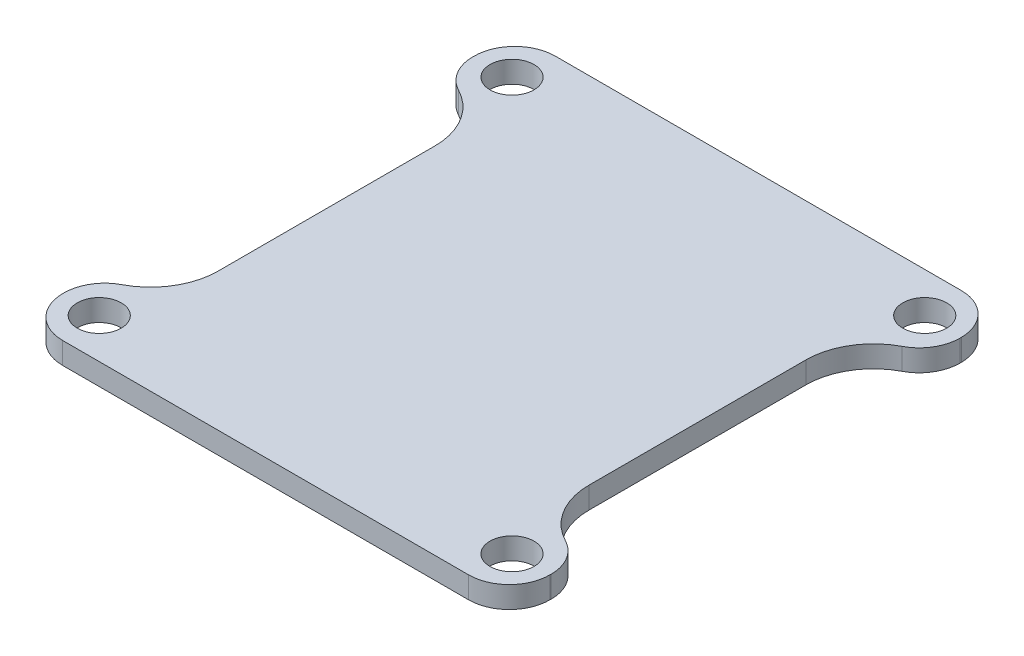
ISO-10303-21;
HEADER;
FILE_DESCRIPTION(('STEP AP214'),'2;1');
FILE_NAME('part.step','',(''),(''),'','','');
FILE_SCHEMA(('AUTOMOTIVE_DESIGN { 1 0 10303 214 1 1 1 1 }'));
ENDSEC;
DATA;
#1=APPLICATION_CONTEXT('core data for automotive mechanical design processes');
#2=APPLICATION_PROTOCOL_DEFINITION('international standard','automotive_design',2000,#1);
#3=PRODUCT_CONTEXT('',#1,'mechanical');
#4=PRODUCT('Part','Part','',(#3));
#5=PRODUCT_RELATED_PRODUCT_CATEGORY('part','',(#4));
#6=PRODUCT_DEFINITION_FORMATION('','',#4);
#7=PRODUCT_DEFINITION_CONTEXT('part definition',#1,'design');
#8=PRODUCT_DEFINITION('design','',#6,#7);
#9=PRODUCT_DEFINITION_SHAPE('','',#8);
#10=(LENGTH_UNIT() NAMED_UNIT(*) SI_UNIT(.MILLI.,.METRE.));
#11=(NAMED_UNIT(*) PLANE_ANGLE_UNIT() SI_UNIT($,.RADIAN.));
#12=(NAMED_UNIT(*) SI_UNIT($,.STERADIAN.) SOLID_ANGLE_UNIT());
#13=UNCERTAINTY_MEASURE_WITH_UNIT(LENGTH_MEASURE(1.E-05),#10,'distance_accuracy_value','');
#14=(GEOMETRIC_REPRESENTATION_CONTEXT(3) GLOBAL_UNCERTAINTY_ASSIGNED_CONTEXT((#13)) GLOBAL_UNIT_ASSIGNED_CONTEXT((#10,
#11,#12)) REPRESENTATION_CONTEXT('',''));
#15=CARTESIAN_POINT('',(0.,0.,0.));
#16=DIRECTION('',(0.,0.,1.));
#17=DIRECTION('',(1.,0.,0.));
#18=AXIS2_PLACEMENT_3D('',#15,#16,#17);
#19=CARTESIAN_POINT('',(0.,1.6,18.2));
#20=DIRECTION('',(0.,0.,-1.));
#21=DIRECTION('',(-1.,0.,0.));
#22=AXIS2_PLACEMENT_3D('',#19,#20,#21);
#23=PLANE('',#22);
#24=DIRECTION('',(1.,0.,0.));
#25=VECTOR('',#24,1.);
#26=CARTESIAN_POINT('',(0.,0.,18.2));
#27=LINE('',#26,#25);
#28=CARTESIAN_POINT('',(-15.,0.,18.2));
#29=VERTEX_POINT('',#28);
#30=CARTESIAN_POINT('',(15.,0.,18.2));
#31=VERTEX_POINT('',#30);
#32=EDGE_CURVE('E340',#29,#31,#27,.T.);
#33=ORIENTED_EDGE('',*,*,#32,.T.);
#34=DIRECTION('',(0.,-1.,0.));
#35=VECTOR('',#34,1.);
#36=CARTESIAN_POINT('',(15.,1.6,18.2));
#37=LINE('',#36,#35);
#38=CARTESIAN_POINT('',(15.,1.6,18.2));
#39=VERTEX_POINT('',#38);
#40=EDGE_CURVE('E267',#31,#39,#37,.F.);
#41=ORIENTED_EDGE('',*,*,#40,.T.);
#42=DIRECTION('',(1.,0.,0.));
#43=VECTOR('',#42,1.);
#44=CARTESIAN_POINT('',(0.,1.6,18.2));
#45=LINE('',#44,#43);
#46=CARTESIAN_POINT('',(-15.,1.6,18.2));
#47=VERTEX_POINT('',#46);
#48=EDGE_CURVE('E369',#47,#39,#45,.T.);
#49=ORIENTED_EDGE('',*,*,#48,.F.);
#50=DIRECTION('',(0.,-1.,0.));
#51=VECTOR('',#50,1.);
#52=CARTESIAN_POINT('',(-15.,1.6,18.2));
#53=LINE('',#52,#51);
#54=EDGE_CURVE('E264',#47,#29,#53,.T.);
#55=ORIENTED_EDGE('',*,*,#54,.T.);
#56=EDGE_LOOP('',(#33,#41,#49,#55));
#57=FACE_BOUND('',#56,.T.);
#58=ADVANCED_FACE('F39',(#57),#23,.F.);
#59=CARTESIAN_POINT('',(18.,1.6,0.));
#60=DIRECTION('',(1.,0.,0.));
#61=DIRECTION('',(0.,0.,-1.));
#62=AXIS2_PLACEMENT_3D('',#59,#60,#61);
#63=PLANE('',#62);
#64=DIRECTION('',(0.,0.,1.));
#65=VECTOR('',#64,1.);
#66=CARTESIAN_POINT('',(18.,0.,0.));
#67=LINE('',#66,#65);
#68=CARTESIAN_POINT('',(18.,0.,15.1));
#69=VERTEX_POINT('',#68);
#70=CARTESIAN_POINT('',(18.,0.,15.2));
#71=VERTEX_POINT('',#70);
#72=EDGE_CURVE('E337',#69,#71,#67,.T.);
#73=ORIENTED_EDGE('',*,*,#72,.F.);
#74=DIRECTION('',(0.,-1.,0.));
#75=VECTOR('',#74,1.);
#76=CARTESIAN_POINT('',(18.,1.6,15.1));
#77=LINE('',#76,#75);
#78=CARTESIAN_POINT('',(18.,1.6,15.1));
#79=VERTEX_POINT('',#78);
#80=EDGE_CURVE('E262',#69,#79,#77,.F.);
#81=ORIENTED_EDGE('',*,*,#80,.T.);
#82=DIRECTION('',(0.,0.,1.));
#83=VECTOR('',#82,1.);
#84=CARTESIAN_POINT('',(18.,1.6,0.));
#85=LINE('',#84,#83);
#86=CARTESIAN_POINT('',(18.,1.6,15.2));
#87=VERTEX_POINT('',#86);
#88=EDGE_CURVE('E366',#79,#87,#85,.T.);
#89=ORIENTED_EDGE('',*,*,#88,.T.);
#90=DIRECTION('',(0.,-1.,0.));
#91=VECTOR('',#90,1.);
#92=CARTESIAN_POINT('',(18.,0.,15.2));
#93=LINE('',#92,#91);
#94=EDGE_CURVE('E259',#87,#71,#93,.T.);
#95=ORIENTED_EDGE('',*,*,#94,.T.);
#96=EDGE_LOOP('',(#73,#81,#89,#95));
#97=FACE_BOUND('',#96,.T.);
#98=ADVANCED_FACE('F393',(#97),#63,.T.);
#99=CARTESIAN_POINT('',(13.7,1.6,0.));
#100=DIRECTION('',(1.,0.,0.));
#101=DIRECTION('',(0.,0.,-1.));
#102=AXIS2_PLACEMENT_3D('',#99,#100,#101);
#103=PLANE('',#102);
#104=DIRECTION('',(0.,0.,1.));
#105=VECTOR('',#104,1.);
#106=CARTESIAN_POINT('',(13.7,0.,0.));
#107=LINE('',#106,#105);
#108=CARTESIAN_POINT('',(13.7,0.,-8.00704574947786));
#109=VERTEX_POINT('',#108);
#110=CARTESIAN_POINT('',(13.7,0.,8.00704574947787));
#111=VERTEX_POINT('',#110);
#112=EDGE_CURVE('E334',#109,#111,#107,.T.);
#113=ORIENTED_EDGE('',*,*,#112,.F.);
#114=DIRECTION('',(0.,1.,0.));
#115=VECTOR('',#114,1.);
#116=CARTESIAN_POINT('',(13.7,1.6,-8.00704574947786));
#117=LINE('',#116,#115);
#118=CARTESIAN_POINT('',(13.7,1.6,-8.00704574947786));
#119=VERTEX_POINT('',#118);
#120=EDGE_CURVE('E280',#109,#119,#117,.T.);
#121=ORIENTED_EDGE('',*,*,#120,.T.);
#122=DIRECTION('',(0.,0.,1.));
#123=VECTOR('',#122,1.);
#124=CARTESIAN_POINT('',(13.7,1.6,0.));
#125=LINE('',#124,#123);
#126=CARTESIAN_POINT('',(13.7,1.6,8.00704574947787));
#127=VERTEX_POINT('',#126);
#128=EDGE_CURVE('E363',#119,#127,#125,.T.);
#129=ORIENTED_EDGE('',*,*,#128,.T.);
#130=DIRECTION('',(0.,-1.,0.));
#131=VECTOR('',#130,1.);
#132=CARTESIAN_POINT('',(13.7,0.,8.00704574947787));
#133=LINE('',#132,#131);
#134=EDGE_CURVE('E277',#127,#111,#133,.T.);
#135=ORIENTED_EDGE('',*,*,#134,.T.);
#136=EDGE_LOOP('',(#113,#121,#129,#135));
#137=FACE_BOUND('',#136,.T.);
#138=ADVANCED_FACE('F399',(#137),#103,.T.);
#139=CARTESIAN_POINT('',(18.,1.6,0.));
#140=DIRECTION('',(1.,0.,0.));
#141=DIRECTION('',(0.,0.,-1.));
#142=AXIS2_PLACEMENT_3D('',#139,#140,#141);
#143=PLANE('',#142);
#144=DIRECTION('',(0.,0.,1.));
#145=VECTOR('',#144,1.);
#146=CARTESIAN_POINT('',(18.,1.6,0.));
#147=LINE('',#146,#145);
#148=CARTESIAN_POINT('',(18.,1.6,-15.2));
#149=VERTEX_POINT('',#148);
#150=CARTESIAN_POINT('',(18.,1.6,-15.1));
#151=VERTEX_POINT('',#150);
#152=EDGE_CURVE('E360',#149,#151,#147,.T.);
#153=ORIENTED_EDGE('',*,*,#152,.T.);
#154=DIRECTION('',(0.,-1.,0.));
#155=VECTOR('',#154,1.);
#156=CARTESIAN_POINT('',(18.,1.6,-15.1));
#157=LINE('',#156,#155);
#158=CARTESIAN_POINT('',(18.,0.,-15.1));
#159=VERTEX_POINT('',#158);
#160=EDGE_CURVE('E256',#151,#159,#157,.T.);
#161=ORIENTED_EDGE('',*,*,#160,.T.);
#162=DIRECTION('',(0.,0.,1.));
#163=VECTOR('',#162,1.);
#164=CARTESIAN_POINT('',(18.,0.,0.));
#165=LINE('',#164,#163);
#166=CARTESIAN_POINT('',(18.,0.,-15.2));
#167=VERTEX_POINT('',#166);
#168=EDGE_CURVE('E329',#167,#159,#165,.T.);
#169=ORIENTED_EDGE('',*,*,#168,.F.);
#170=DIRECTION('',(0.,-1.,0.));
#171=VECTOR('',#170,1.);
#172=CARTESIAN_POINT('',(18.,1.6,-15.2));
#173=LINE('',#172,#171);
#174=EDGE_CURVE('E254',#167,#149,#173,.F.);
#175=ORIENTED_EDGE('',*,*,#174,.T.);
#176=EDGE_LOOP('',(#153,#161,#169,#175));
#177=FACE_BOUND('',#176,.T.);
#178=ADVANCED_FACE('F523',(#177),#143,.T.);
#179=CARTESIAN_POINT('',(0.,1.6,-18.2));
#180=DIRECTION('',(0.,0.,-1.));
#181=DIRECTION('',(-1.,0.,0.));
#182=AXIS2_PLACEMENT_3D('',#179,#180,#181);
#183=PLANE('',#182);
#184=DIRECTION('',(1.,0.,0.));
#185=VECTOR('',#184,1.);
#186=CARTESIAN_POINT('',(0.,0.,-18.2));
#187=LINE('',#186,#185);
#188=CARTESIAN_POINT('',(-15.,0.,-18.2));
#189=VERTEX_POINT('',#188);
#190=CARTESIAN_POINT('',(15.,0.,-18.2));
#191=VERTEX_POINT('',#190);
#192=EDGE_CURVE('E327',#189,#191,#187,.T.);
#193=ORIENTED_EDGE('',*,*,#192,.F.);
#194=DIRECTION('',(0.,-1.,0.));
#195=VECTOR('',#194,1.);
#196=CARTESIAN_POINT('',(-15.,1.6,-18.2));
#197=LINE('',#196,#195);
#198=CARTESIAN_POINT('',(-15.,1.6,-18.2));
#199=VERTEX_POINT('',#198);
#200=EDGE_CURVE('E272',#189,#199,#197,.F.);
#201=ORIENTED_EDGE('',*,*,#200,.T.);
#202=DIRECTION('',(1.,0.,0.));
#203=VECTOR('',#202,1.);
#204=CARTESIAN_POINT('',(0.,1.6,-18.2));
#205=LINE('',#204,#203);
#206=CARTESIAN_POINT('',(15.,1.6,-18.2));
#207=VERTEX_POINT('',#206);
#208=EDGE_CURVE('E357',#199,#207,#205,.T.);
#209=ORIENTED_EDGE('',*,*,#208,.T.);
#210=DIRECTION('',(0.,-1.,0.));
#211=VECTOR('',#210,1.);
#212=CARTESIAN_POINT('',(15.,1.6,-18.2));
#213=LINE('',#212,#211);
#214=EDGE_CURVE('E269',#207,#191,#213,.T.);
#215=ORIENTED_EDGE('',*,*,#214,.T.);
#216=EDGE_LOOP('',(#193,#201,#209,#215));
#217=FACE_BOUND('',#216,.T.);
#218=ADVANCED_FACE('F567',(#217),#183,.T.);
#219=CARTESIAN_POINT('',(-18.,1.6,0.));
#220=DIRECTION('',(1.,0.,0.));
#221=DIRECTION('',(0.,0.,-1.));
#222=AXIS2_PLACEMENT_3D('',#219,#220,#221);
#223=PLANE('',#222);
#224=DIRECTION('',(0.,0.,1.));
#225=VECTOR('',#224,1.);
#226=CARTESIAN_POINT('',(-18.,0.,0.));
#227=LINE('',#226,#225);
#228=CARTESIAN_POINT('',(-18.,0.,-15.2));
#229=VERTEX_POINT('',#228);
#230=CARTESIAN_POINT('',(-18.,0.,-15.1));
#231=VERTEX_POINT('',#230);
#232=EDGE_CURVE('E209',#229,#231,#227,.T.);
#233=ORIENTED_EDGE('',*,*,#232,.T.);
#234=DIRECTION('',(0.,-1.,0.));
#235=VECTOR('',#234,1.);
#236=CARTESIAN_POINT('',(-18.,1.6,-15.1));
#237=LINE('',#236,#235);
#238=CARTESIAN_POINT('',(-18.,1.6,-15.1));
#239=VERTEX_POINT('',#238);
#240=EDGE_CURVE('E252',#231,#239,#237,.F.);
#241=ORIENTED_EDGE('',*,*,#240,.T.);
#242=DIRECTION('',(0.,0.,1.));
#243=VECTOR('',#242,1.);
#244=CARTESIAN_POINT('',(-18.,1.6,0.));
#245=LINE('',#244,#243);
#246=CARTESIAN_POINT('',(-18.,1.6,-15.2));
#247=VERTEX_POINT('',#246);
#248=EDGE_CURVE('E319',#247,#239,#245,.T.);
#249=ORIENTED_EDGE('',*,*,#248,.F.);
#250=DIRECTION('',(0.,-1.,0.));
#251=VECTOR('',#250,1.);
#252=CARTESIAN_POINT('',(-18.,0.,-15.2));
#253=LINE('',#252,#251);
#254=EDGE_CURVE('E249',#247,#229,#253,.T.);
#255=ORIENTED_EDGE('',*,*,#254,.T.);
#256=EDGE_LOOP('',(#233,#241,#249,#255));
#257=FACE_BOUND('',#256,.T.);
#258=ADVANCED_FACE('F324',(#257),#223,.F.);
#259=CARTESIAN_POINT('',(-13.7,1.6,0.));
#260=DIRECTION('',(1.,0.,0.));
#261=DIRECTION('',(0.,0.,-1.));
#262=AXIS2_PLACEMENT_3D('',#259,#260,#261);
#263=PLANE('',#262);
#264=DIRECTION('',(0.,0.,1.));
#265=VECTOR('',#264,1.);
#266=CARTESIAN_POINT('',(-13.7,0.,0.));
#267=LINE('',#266,#265);
#268=CARTESIAN_POINT('',(-13.7,0.,-8.00704574947786));
#269=VERTEX_POINT('',#268);
#270=CARTESIAN_POINT('',(-13.7,0.,8.00704574947787));
#271=VERTEX_POINT('',#270);
#272=EDGE_CURVE('E203',#269,#271,#267,.T.);
#273=ORIENTED_EDGE('',*,*,#272,.T.);
#274=DIRECTION('',(0.,-1.,0.));
#275=VECTOR('',#274,1.);
#276=CARTESIAN_POINT('',(-13.7,1.6,8.00704574947787));
#277=LINE('',#276,#275);
#278=CARTESIAN_POINT('',(-13.7,1.6,8.00704574947787));
#279=VERTEX_POINT('',#278);
#280=EDGE_CURVE('E288',#271,#279,#277,.F.);
#281=ORIENTED_EDGE('',*,*,#280,.T.);
#282=DIRECTION('',(0.,0.,1.));
#283=VECTOR('',#282,1.);
#284=CARTESIAN_POINT('',(-13.7,1.6,0.));
#285=LINE('',#284,#283);
#286=CARTESIAN_POINT('',(-13.7,1.6,-8.00704574947786));
#287=VERTEX_POINT('',#286);
#288=EDGE_CURVE('E308',#287,#279,#285,.T.);
#289=ORIENTED_EDGE('',*,*,#288,.F.);
#290=DIRECTION('',(0.,1.,0.));
#291=VECTOR('',#290,1.);
#292=CARTESIAN_POINT('',(-13.7,1.6,-8.00704574947786));
#293=LINE('',#292,#291);
#294=EDGE_CURVE('E285',#287,#269,#293,.F.);
#295=ORIENTED_EDGE('',*,*,#294,.T.);
#296=EDGE_LOOP('',(#273,#281,#289,#295));
#297=FACE_BOUND('',#296,.T.);
#298=ADVANCED_FACE('F313',(#297),#263,.F.);
#299=CARTESIAN_POINT('',(-15.25,1.6,-15.25));
#300=DIRECTION('',(0.,-1.,0.));
#301=DIRECTION('',(0.,0.,-1.));
#302=AXIS2_PLACEMENT_3D('',#299,#300,#301);
#303=CYLINDRICAL_SURFACE('',#302,1.625);
#304=CARTESIAN_POINT('',(-15.25,1.6,-15.25));
#305=DIRECTION('',(0.,1.,0.));
#306=DIRECTION('',(0.,0.,1.));
#307=AXIS2_PLACEMENT_3D('',#304,#305,#306);
#308=CIRCLE('',#307,1.625);
#309=CARTESIAN_POINT('',(-15.25,1.6,-13.625));
#310=VERTEX_POINT('',#309);
#311=EDGE_CURVE('E348',#310,#310,#308,.T.);
#312=ORIENTED_EDGE('',*,*,#311,.T.);
#313=EDGE_LOOP('',(#312));
#314=FACE_BOUND('',#313,.T.);
#315=CARTESIAN_POINT('',(-15.25,0.,-15.25));
#316=DIRECTION('',(0.,1.,0.));
#317=DIRECTION('',(0.,0.,1.));
#318=AXIS2_PLACEMENT_3D('',#315,#316,#317);
#319=CIRCLE('',#318,1.625);
#320=CARTESIAN_POINT('',(-15.25,0.,-13.625));
#321=VERTEX_POINT('',#320);
#322=EDGE_CURVE('E206',#321,#321,#319,.T.);
#323=ORIENTED_EDGE('',*,*,#322,.F.);
#324=EDGE_LOOP('',(#323));
#325=FACE_BOUND('',#324,.T.);
#326=ADVANCED_FACE('F510',(#314,#325),#303,.F.);
#327=CARTESIAN_POINT('',(15.25,1.6,15.25));
#328=DIRECTION('',(0.,-1.,0.));
#329=DIRECTION('',(0.,0.,-1.));
#330=AXIS2_PLACEMENT_3D('',#327,#328,#329);
#331=CYLINDRICAL_SURFACE('',#330,1.625);
#332=CARTESIAN_POINT('',(15.25,1.6,15.25));
#333=DIRECTION('',(0.,1.,0.));
#334=DIRECTION('',(0.,0.,1.));
#335=AXIS2_PLACEMENT_3D('',#332,#333,#334);
#336=CIRCLE('',#335,1.625);
#337=CARTESIAN_POINT('',(15.25,1.6,16.875));
#338=VERTEX_POINT('',#337);
#339=EDGE_CURVE('E351',#338,#338,#336,.T.);
#340=ORIENTED_EDGE('',*,*,#339,.T.);
#341=EDGE_LOOP('',(#340));
#342=FACE_BOUND('',#341,.T.);
#343=CARTESIAN_POINT('',(15.25,0.,15.25));
#344=DIRECTION('',(0.,1.,0.));
#345=DIRECTION('',(0.,0.,1.));
#346=AXIS2_PLACEMENT_3D('',#343,#344,#345);
#347=CIRCLE('',#346,1.625);
#348=CARTESIAN_POINT('',(15.25,0.,16.875));
#349=VERTEX_POINT('',#348);
#350=EDGE_CURVE('E202',#349,#349,#347,.T.);
#351=ORIENTED_EDGE('',*,*,#350,.F.);
#352=EDGE_LOOP('',(#351));
#353=FACE_BOUND('',#352,.T.);
#354=ADVANCED_FACE('F557',(#342,#353),#331,.F.);
#355=CARTESIAN_POINT('',(-18.,1.6,0.));
#356=DIRECTION('',(1.,0.,0.));
#357=DIRECTION('',(0.,0.,-1.));
#358=AXIS2_PLACEMENT_3D('',#355,#356,#357);
#359=PLANE('',#358);
#360=DIRECTION('',(0.,0.,1.));
#361=VECTOR('',#360,1.);
#362=CARTESIAN_POINT('',(-18.,1.6,0.));
#363=LINE('',#362,#361);
#364=CARTESIAN_POINT('',(-18.,1.6,15.1));
#365=VERTEX_POINT('',#364);
#366=CARTESIAN_POINT('',(-18.,1.6,15.2));
#367=VERTEX_POINT('',#366);
#368=EDGE_CURVE('E194',#365,#367,#363,.T.);
#369=ORIENTED_EDGE('',*,*,#368,.F.);
#370=DIRECTION('',(0.,-1.,0.));
#371=VECTOR('',#370,1.);
#372=CARTESIAN_POINT('',(-18.,1.6,15.1));
#373=LINE('',#372,#371);
#374=CARTESIAN_POINT('',(-18.,0.,15.1));
#375=VERTEX_POINT('',#374);
#376=EDGE_CURVE('E180',#365,#375,#373,.T.);
#377=ORIENTED_EDGE('',*,*,#376,.T.);
#378=DIRECTION('',(0.,0.,1.));
#379=VECTOR('',#378,1.);
#380=CARTESIAN_POINT('',(-18.,0.,0.));
#381=LINE('',#380,#379);
#382=CARTESIAN_POINT('',(-18.,0.,15.2));
#383=VERTEX_POINT('',#382);
#384=EDGE_CURVE('E191',#375,#383,#381,.T.);
#385=ORIENTED_EDGE('',*,*,#384,.T.);
#386=DIRECTION('',(0.,-1.,0.));
#387=VECTOR('',#386,1.);
#388=CARTESIAN_POINT('',(-18.,1.6,15.2));
#389=LINE('',#388,#387);
#390=EDGE_CURVE('E196',#383,#367,#389,.F.);
#391=ORIENTED_EDGE('',*,*,#390,.T.);
#392=EDGE_LOOP('',(#369,#377,#385,#391));
#393=FACE_BOUND('',#392,.T.);
#394=ADVANCED_FACE('F190',(#393),#359,.F.);
#395=CARTESIAN_POINT('',(-15.25,1.6,15.25));
#396=DIRECTION('',(0.,-1.,0.));
#397=DIRECTION('',(0.,0.,-1.));
#398=AXIS2_PLACEMENT_3D('',#395,#396,#397);
#399=CYLINDRICAL_SURFACE('',#398,1.625);
#400=CARTESIAN_POINT('',(-15.25,1.6,15.25));
#401=DIRECTION('',(0.,1.,0.));
#402=DIRECTION('',(0.,0.,1.));
#403=AXIS2_PLACEMENT_3D('',#400,#401,#402);
#404=CIRCLE('',#403,1.625);
#405=CARTESIAN_POINT('',(-15.25,1.6,16.875));
#406=VERTEX_POINT('',#405);
#407=EDGE_CURVE('E218',#406,#406,#404,.F.);
#408=ORIENTED_EDGE('',*,*,#407,.F.);
#409=EDGE_LOOP('',(#408));
#410=FACE_BOUND('',#409,.T.);
#411=CARTESIAN_POINT('',(-15.25,0.,15.25));
#412=DIRECTION('',(0.,1.,0.));
#413=DIRECTION('',(0.,0.,1.));
#414=AXIS2_PLACEMENT_3D('',#411,#412,#413);
#415=CIRCLE('',#414,1.625);
#416=CARTESIAN_POINT('',(-15.25,0.,16.875));
#417=VERTEX_POINT('',#416);
#418=EDGE_CURVE('E343',#417,#417,#415,.F.);
#419=ORIENTED_EDGE('',*,*,#418,.T.);
#420=EDGE_LOOP('',(#419));
#421=FACE_BOUND('',#420,.T.);
#422=ADVANCED_FACE('F376',(#410,#421),#399,.F.);
#423=CARTESIAN_POINT('',(15.25,1.6,-15.25));
#424=DIRECTION('',(0.,-1.,0.));
#425=DIRECTION('',(0.,0.,-1.));
#426=AXIS2_PLACEMENT_3D('',#423,#424,#425);
#427=CYLINDRICAL_SURFACE('',#426,1.625);
#428=CARTESIAN_POINT('',(15.25,1.6,-15.25));
#429=DIRECTION('',(0.,1.,0.));
#430=DIRECTION('',(0.,0.,1.));
#431=AXIS2_PLACEMENT_3D('',#428,#429,#430);
#432=CIRCLE('',#431,1.625);
#433=CARTESIAN_POINT('',(15.25,1.6,-13.625));
#434=VERTEX_POINT('',#433);
#435=EDGE_CURVE('E219',#434,#434,#432,.F.);
#436=ORIENTED_EDGE('',*,*,#435,.F.);
#437=EDGE_LOOP('',(#436));
#438=FACE_BOUND('',#437,.T.);
#439=CARTESIAN_POINT('',(15.25,0.,-15.25));
#440=DIRECTION('',(0.,1.,0.));
#441=DIRECTION('',(0.,0.,1.));
#442=AXIS2_PLACEMENT_3D('',#439,#440,#441);
#443=CIRCLE('',#442,1.625);
#444=CARTESIAN_POINT('',(15.25,0.,-13.625));
#445=VERTEX_POINT('',#444);
#446=EDGE_CURVE('E215',#445,#445,#443,.F.);
#447=ORIENTED_EDGE('',*,*,#446,.T.);
#448=EDGE_LOOP('',(#447));
#449=FACE_BOUND('',#448,.T.);
#450=ADVANCED_FACE('F379',(#438,#449),#427,.F.);
#451=CARTESIAN_POINT('',(0.,1.6,0.));
#452=DIRECTION('',(0.,1.,0.));
#453=DIRECTION('',(0.,0.,1.));
#454=AXIS2_PLACEMENT_3D('',#451,#452,#453);
#455=PLANE('',#454);
#456=ORIENTED_EDGE('',*,*,#407,.T.);
#457=EDGE_LOOP('',(#456));
#458=FACE_BOUND('',#457,.T.);
#459=ORIENTED_EDGE('',*,*,#288,.T.);
#460=CARTESIAN_POINT('',(-18.7,1.6,8.00704574947787));
#461=DIRECTION('',(0.,1.,0.));
#462=DIRECTION('',(0.,0.,1.));
#463=AXIS2_PLACEMENT_3D('',#460,#461,#462);
#464=CIRCLE('',#463,5.);
#465=CARTESIAN_POINT('',(-16.3875,1.6,12.4401421560542));
#466=VERTEX_POINT('',#465);
#467=EDGE_CURVE('E301',#279,#466,#464,.F.);
#468=ORIENTED_EDGE('',*,*,#467,.T.);
#469=CARTESIAN_POINT('',(-15.,1.6,15.1));
#470=DIRECTION('',(0.,1.,0.));
#471=DIRECTION('',(0.,0.,1.));
#472=AXIS2_PLACEMENT_3D('',#469,#470,#471);
#473=CIRCLE('',#472,3.);
#474=EDGE_CURVE('E247',#466,#365,#473,.T.);
#475=ORIENTED_EDGE('',*,*,#474,.T.);
#476=ORIENTED_EDGE('',*,*,#368,.T.);
#477=CARTESIAN_POINT('',(-15.,1.6,15.2));
#478=DIRECTION('',(0.,1.,0.));
#479=DIRECTION('',(0.,0.,1.));
#480=AXIS2_PLACEMENT_3D('',#477,#478,#479);
#481=CIRCLE('',#480,3.);
#482=EDGE_CURVE('E236',#367,#47,#481,.T.);
#483=ORIENTED_EDGE('',*,*,#482,.T.);
#484=ORIENTED_EDGE('',*,*,#48,.T.);
#485=CARTESIAN_POINT('',(15.,1.6,15.2));
#486=DIRECTION('',(0.,1.,0.));
#487=DIRECTION('',(0.,0.,1.));
#488=AXIS2_PLACEMENT_3D('',#485,#486,#487);
#489=CIRCLE('',#488,3.);
#490=EDGE_CURVE('E238',#39,#87,#489,.T.);
#491=ORIENTED_EDGE('',*,*,#490,.T.);
#492=ORIENTED_EDGE('',*,*,#88,.F.);
#493=CARTESIAN_POINT('',(15.,1.6,15.1));
#494=DIRECTION('',(0.,1.,0.));
#495=DIRECTION('',(0.,0.,1.));
#496=AXIS2_PLACEMENT_3D('',#493,#494,#495);
#497=CIRCLE('',#496,3.);
#498=CARTESIAN_POINT('',(16.3875,1.6,12.4401421560542));
#499=VERTEX_POINT('',#498);
#500=EDGE_CURVE('E240',#79,#499,#497,.T.);
#501=ORIENTED_EDGE('',*,*,#500,.T.);
#502=CARTESIAN_POINT('',(18.7,1.6,8.00704574947787));
#503=DIRECTION('',(0.,1.,0.));
#504=DIRECTION('',(0.,0.,1.));
#505=AXIS2_PLACEMENT_3D('',#502,#503,#504);
#506=CIRCLE('',#505,5.);
#507=EDGE_CURVE('E297',#499,#127,#506,.F.);
#508=ORIENTED_EDGE('',*,*,#507,.T.);
#509=ORIENTED_EDGE('',*,*,#128,.F.);
#510=CARTESIAN_POINT('',(18.7,1.6,-8.00704574947786));
#511=DIRECTION('',(0.,1.,0.));
#512=DIRECTION('',(0.,0.,1.));
#513=AXIS2_PLACEMENT_3D('',#510,#511,#512);
#514=CIRCLE('',#513,5.);
#515=CARTESIAN_POINT('',(16.3875,1.6,-12.4401421560542));
#516=VERTEX_POINT('',#515);
#517=EDGE_CURVE('E293',#119,#516,#514,.F.);
#518=ORIENTED_EDGE('',*,*,#517,.T.);
#519=CARTESIAN_POINT('',(15.,1.6,-15.1));
#520=DIRECTION('',(0.,1.,0.));
#521=DIRECTION('',(0.,0.,1.));
#522=AXIS2_PLACEMENT_3D('',#519,#520,#521);
#523=CIRCLE('',#522,3.);
#524=EDGE_CURVE('E243',#516,#151,#523,.T.);
#525=ORIENTED_EDGE('',*,*,#524,.T.);
#526=ORIENTED_EDGE('',*,*,#152,.F.);
#527=CARTESIAN_POINT('',(15.,1.6,-15.2));
#528=DIRECTION('',(0.,1.,0.));
#529=DIRECTION('',(0.,0.,1.));
#530=AXIS2_PLACEMENT_3D('',#527,#528,#529);
#531=CIRCLE('',#530,3.);
#532=EDGE_CURVE('E184',#149,#207,#531,.T.);
#533=ORIENTED_EDGE('',*,*,#532,.T.);
#534=ORIENTED_EDGE('',*,*,#208,.F.);
#535=CARTESIAN_POINT('',(-15.,1.6,-15.2));
#536=DIRECTION('',(0.,1.,0.));
#537=DIRECTION('',(0.,0.,1.));
#538=AXIS2_PLACEMENT_3D('',#535,#536,#537);
#539=CIRCLE('',#538,3.);
#540=EDGE_CURVE('E234',#199,#247,#539,.T.);
#541=ORIENTED_EDGE('',*,*,#540,.T.);
#542=ORIENTED_EDGE('',*,*,#248,.T.);
#543=CARTESIAN_POINT('',(-15.,1.6,-15.1));
#544=DIRECTION('',(0.,1.,0.));
#545=DIRECTION('',(0.,0.,1.));
#546=AXIS2_PLACEMENT_3D('',#543,#544,#545);
#547=CIRCLE('',#546,3.);
#548=CARTESIAN_POINT('',(-16.3875,1.6,-12.4401421560542));
#549=VERTEX_POINT('',#548);
#550=EDGE_CURVE('E245',#239,#549,#547,.T.);
#551=ORIENTED_EDGE('',*,*,#550,.T.);
#552=CARTESIAN_POINT('',(-18.7,1.6,-8.00704574947786));
#553=DIRECTION('',(0.,1.,0.));
#554=DIRECTION('',(0.,0.,1.));
#555=AXIS2_PLACEMENT_3D('',#552,#553,#554);
#556=CIRCLE('',#555,5.);
#557=EDGE_CURVE('E11',#549,#287,#556,.F.);
#558=ORIENTED_EDGE('',*,*,#557,.T.);
#559=EDGE_LOOP('',(#459,#468,#475,#476,#483,#484,#491,#492,#501,#508,#509,#518,#525,#526,#533,
#534,#541,#542,#551,#558));
#560=FACE_BOUND('',#559,.T.);
#561=ORIENTED_EDGE('',*,*,#339,.F.);
#562=EDGE_LOOP('',(#561));
#563=FACE_BOUND('',#562,.T.);
#564=ORIENTED_EDGE('',*,*,#311,.F.);
#565=EDGE_LOOP('',(#564));
#566=FACE_BOUND('',#565,.T.);
#567=ORIENTED_EDGE('',*,*,#435,.T.);
#568=EDGE_LOOP('',(#567));
#569=FACE_BOUND('',#568,.T.);
#570=ADVANCED_FACE('F305',(#458,#560,#563,#566,#569),#455,.T.);
#571=CARTESIAN_POINT('',(0.,0.,0.));
#572=DIRECTION('',(0.,1.,0.));
#573=DIRECTION('',(0.,0.,1.));
#574=AXIS2_PLACEMENT_3D('',#571,#572,#573);
#575=PLANE('',#574);
#576=ORIENTED_EDGE('',*,*,#418,.F.);
#577=EDGE_LOOP('',(#576));
#578=FACE_BOUND('',#577,.T.);
#579=ORIENTED_EDGE('',*,*,#384,.F.);
#580=CARTESIAN_POINT('',(-15.,0.,15.1));
#581=DIRECTION('',(0.,1.,0.));
#582=DIRECTION('',(0.,0.,1.));
#583=AXIS2_PLACEMENT_3D('',#580,#581,#582);
#584=CIRCLE('',#583,3.);
#585=CARTESIAN_POINT('',(-16.3875,0.,12.4401421560542));
#586=VERTEX_POINT('',#585);
#587=EDGE_CURVE('E176',#375,#586,#584,.F.);
#588=ORIENTED_EDGE('',*,*,#587,.T.);
#589=CARTESIAN_POINT('',(-18.7,0.,8.00704574947787));
#590=DIRECTION('',(0.,1.,0.));
#591=DIRECTION('',(0.,0.,1.));
#592=AXIS2_PLACEMENT_3D('',#589,#590,#591);
#593=CIRCLE('',#592,5.);
#594=EDGE_CURVE('E299',#586,#271,#593,.T.);
#595=ORIENTED_EDGE('',*,*,#594,.T.);
#596=ORIENTED_EDGE('',*,*,#272,.F.);
#597=CARTESIAN_POINT('',(-18.7,0.,-8.00704574947786));
#598=DIRECTION('',(0.,1.,0.));
#599=DIRECTION('',(0.,0.,1.));
#600=AXIS2_PLACEMENT_3D('',#597,#598,#599);
#601=CIRCLE('',#600,5.);
#602=CARTESIAN_POINT('',(-16.3875,0.,-12.4401421560542));
#603=VERTEX_POINT('',#602);
#604=EDGE_CURVE('E47',#269,#603,#601,.T.);
#605=ORIENTED_EDGE('',*,*,#604,.T.);
#606=CARTESIAN_POINT('',(-15.,0.,-15.1));
#607=DIRECTION('',(0.,1.,0.));
#608=DIRECTION('',(0.,0.,1.));
#609=AXIS2_PLACEMENT_3D('',#606,#607,#608);
#610=CIRCLE('',#609,3.);
#611=EDGE_CURVE('E185',#603,#231,#610,.F.);
#612=ORIENTED_EDGE('',*,*,#611,.T.);
#613=ORIENTED_EDGE('',*,*,#232,.F.);
#614=CARTESIAN_POINT('',(-15.,0.,-15.2));
#615=DIRECTION('',(0.,1.,0.));
#616=DIRECTION('',(0.,0.,1.));
#617=AXIS2_PLACEMENT_3D('',#614,#615,#616);
#618=CIRCLE('',#617,3.);
#619=EDGE_CURVE('E222',#229,#189,#618,.F.);
#620=ORIENTED_EDGE('',*,*,#619,.T.);
#621=ORIENTED_EDGE('',*,*,#192,.T.);
#622=CARTESIAN_POINT('',(15.,0.,-15.2));
#623=DIRECTION('',(0.,1.,0.));
#624=DIRECTION('',(0.,0.,1.));
#625=AXIS2_PLACEMENT_3D('',#622,#623,#624);
#626=CIRCLE('',#625,3.);
#627=EDGE_CURVE('E195',#191,#167,#626,.F.);
#628=ORIENTED_EDGE('',*,*,#627,.T.);
#629=ORIENTED_EDGE('',*,*,#168,.T.);
#630=CARTESIAN_POINT('',(15.,0.,-15.1));
#631=DIRECTION('',(0.,1.,0.));
#632=DIRECTION('',(0.,0.,1.));
#633=AXIS2_PLACEMENT_3D('',#630,#631,#632);
#634=CIRCLE('',#633,3.);
#635=CARTESIAN_POINT('',(16.3875,0.,-12.4401421560542));
#636=VERTEX_POINT('',#635);
#637=EDGE_CURVE('E229',#159,#636,#634,.F.);
#638=ORIENTED_EDGE('',*,*,#637,.T.);
#639=CARTESIAN_POINT('',(18.7,0.,-8.00704574947786));
#640=DIRECTION('',(0.,1.,0.));
#641=DIRECTION('',(0.,0.,1.));
#642=AXIS2_PLACEMENT_3D('',#639,#640,#641);
#643=CIRCLE('',#642,5.);
#644=EDGE_CURVE('E291',#636,#109,#643,.T.);
#645=ORIENTED_EDGE('',*,*,#644,.T.);
#646=ORIENTED_EDGE('',*,*,#112,.T.);
#647=CARTESIAN_POINT('',(18.7,0.,8.00704574947787));
#648=DIRECTION('',(0.,1.,0.));
#649=DIRECTION('',(0.,0.,1.));
#650=AXIS2_PLACEMENT_3D('',#647,#648,#649);
#651=CIRCLE('',#650,5.);
#652=CARTESIAN_POINT('',(16.3875,0.,12.4401421560542));
#653=VERTEX_POINT('',#652);
#654=EDGE_CURVE('E295',#111,#653,#651,.T.);
#655=ORIENTED_EDGE('',*,*,#654,.T.);
#656=CARTESIAN_POINT('',(15.,0.,15.1));
#657=DIRECTION('',(0.,1.,0.));
#658=DIRECTION('',(0.,0.,1.));
#659=AXIS2_PLACEMENT_3D('',#656,#657,#658);
#660=CIRCLE('',#659,3.);
#661=EDGE_CURVE('E227',#653,#69,#660,.F.);
#662=ORIENTED_EDGE('',*,*,#661,.T.);
#663=ORIENTED_EDGE('',*,*,#72,.T.);
#664=CARTESIAN_POINT('',(15.,0.,15.2));
#665=DIRECTION('',(0.,1.,0.));
#666=DIRECTION('',(0.,0.,1.));
#667=AXIS2_PLACEMENT_3D('',#664,#665,#666);
#668=CIRCLE('',#667,3.);
#669=EDGE_CURVE('E225',#71,#31,#668,.F.);
#670=ORIENTED_EDGE('',*,*,#669,.T.);
#671=ORIENTED_EDGE('',*,*,#32,.F.);
#672=CARTESIAN_POINT('',(-15.,0.,15.2));
#673=DIRECTION('',(0.,1.,0.));
#674=DIRECTION('',(0.,0.,1.));
#675=AXIS2_PLACEMENT_3D('',#672,#673,#674);
#676=CIRCLE('',#675,3.);
#677=EDGE_CURVE('E201',#29,#383,#676,.F.);
#678=ORIENTED_EDGE('',*,*,#677,.T.);
#679=EDGE_LOOP('',(#579,#588,#595,#596,#605,#612,#613,#620,#621,#628,#629,#638,#645,#646,#655,
#662,#663,#670,#671,#678));
#680=FACE_BOUND('',#679,.T.);
#681=ORIENTED_EDGE('',*,*,#350,.T.);
#682=EDGE_LOOP('',(#681));
#683=FACE_BOUND('',#682,.T.);
#684=ORIENTED_EDGE('',*,*,#322,.T.);
#685=EDGE_LOOP('',(#684));
#686=FACE_BOUND('',#685,.T.);
#687=ORIENTED_EDGE('',*,*,#446,.F.);
#688=EDGE_LOOP('',(#687));
#689=FACE_BOUND('',#688,.T.);
#690=ADVANCED_FACE('F198',(#578,#680,#683,#686,#689),#575,.F.);
#691=CARTESIAN_POINT('',(-15.,1.6,15.1));
#692=DIRECTION('',(0.,-1.,0.));
#693=DIRECTION('',(0.,0.,-1.));
#694=AXIS2_PLACEMENT_3D('',#691,#692,#693);
#695=CYLINDRICAL_SURFACE('',#694,3.);
#696=ORIENTED_EDGE('',*,*,#474,.F.);
#697=DIRECTION('',(0.,-1.,0.));
#698=VECTOR('',#697,1.);
#699=CARTESIAN_POINT('',(-16.3875,1.6,12.4401421560542));
#700=LINE('',#699,#698);
#701=EDGE_CURVE('E182',#466,#586,#700,.T.);
#702=ORIENTED_EDGE('',*,*,#701,.T.);
#703=ORIENTED_EDGE('',*,*,#587,.F.);
#704=ORIENTED_EDGE('',*,*,#376,.F.);
#705=EDGE_LOOP('',(#696,#702,#703,#704));
#706=FACE_BOUND('',#705,.T.);
#707=ADVANCED_FACE('F179',(#706),#695,.T.);
#708=CARTESIAN_POINT('',(-15.,1.6,-15.1));
#709=DIRECTION('',(0.,1.,0.));
#710=DIRECTION('',(0.,0.,1.));
#711=AXIS2_PLACEMENT_3D('',#708,#709,#710);
#712=CYLINDRICAL_SURFACE('',#711,3.);
#713=ORIENTED_EDGE('',*,*,#611,.F.);
#714=DIRECTION('',(0.,1.,0.));
#715=VECTOR('',#714,1.);
#716=CARTESIAN_POINT('',(-16.3875,1.6,-12.4401421560542));
#717=LINE('',#716,#715);
#718=EDGE_CURVE('E60',#603,#549,#717,.T.);
#719=ORIENTED_EDGE('',*,*,#718,.T.);
#720=ORIENTED_EDGE('',*,*,#550,.F.);
#721=ORIENTED_EDGE('',*,*,#240,.F.);
#722=EDGE_LOOP('',(#713,#719,#720,#721));
#723=FACE_BOUND('',#722,.T.);
#724=ADVANCED_FACE('F321',(#723),#712,.T.);
#725=CARTESIAN_POINT('',(15.,1.6,-15.1));
#726=DIRECTION('',(0.,-1.,0.));
#727=DIRECTION('',(0.,0.,-1.));
#728=AXIS2_PLACEMENT_3D('',#725,#726,#727);
#729=CYLINDRICAL_SURFACE('',#728,3.);
#730=ORIENTED_EDGE('',*,*,#524,.F.);
#731=DIRECTION('',(0.,-1.,0.));
#732=VECTOR('',#731,1.);
#733=CARTESIAN_POINT('',(16.3875,1.6,-12.4401421560542));
#734=LINE('',#733,#732);
#735=EDGE_CURVE('E274',#516,#636,#734,.T.);
#736=ORIENTED_EDGE('',*,*,#735,.T.);
#737=ORIENTED_EDGE('',*,*,#637,.F.);
#738=ORIENTED_EDGE('',*,*,#160,.F.);
#739=EDGE_LOOP('',(#730,#736,#737,#738));
#740=FACE_BOUND('',#739,.T.);
#741=ADVANCED_FACE('F406',(#740),#729,.T.);
#742=CARTESIAN_POINT('',(15.,1.6,15.1));
#743=DIRECTION('',(0.,1.,0.));
#744=DIRECTION('',(0.,0.,1.));
#745=AXIS2_PLACEMENT_3D('',#742,#743,#744);
#746=CYLINDRICAL_SURFACE('',#745,3.);
#747=ORIENTED_EDGE('',*,*,#661,.F.);
#748=DIRECTION('',(0.,1.,0.));
#749=VECTOR('',#748,1.);
#750=CARTESIAN_POINT('',(16.3875,1.6,12.4401421560542));
#751=LINE('',#750,#749);
#752=EDGE_CURVE('E282',#653,#499,#751,.T.);
#753=ORIENTED_EDGE('',*,*,#752,.T.);
#754=ORIENTED_EDGE('',*,*,#500,.F.);
#755=ORIENTED_EDGE('',*,*,#80,.F.);
#756=EDGE_LOOP('',(#747,#753,#754,#755));
#757=FACE_BOUND('',#756,.T.);
#758=ADVANCED_FACE('F409',(#757),#746,.T.);
#759=CARTESIAN_POINT('',(15.,1.6,15.2));
#760=DIRECTION('',(0.,1.,0.));
#761=DIRECTION('',(0.,0.,1.));
#762=AXIS2_PLACEMENT_3D('',#759,#760,#761);
#763=CYLINDRICAL_SURFACE('',#762,3.);
#764=ORIENTED_EDGE('',*,*,#490,.F.);
#765=ORIENTED_EDGE('',*,*,#40,.F.);
#766=ORIENTED_EDGE('',*,*,#669,.F.);
#767=ORIENTED_EDGE('',*,*,#94,.F.);
#768=EDGE_LOOP('',(#764,#765,#766,#767));
#769=FACE_BOUND('',#768,.T.);
#770=ADVANCED_FACE('F413',(#769),#763,.T.);
#771=CARTESIAN_POINT('',(-15.,1.6,15.2));
#772=DIRECTION('',(0.,-1.,0.));
#773=DIRECTION('',(0.,0.,-1.));
#774=AXIS2_PLACEMENT_3D('',#771,#772,#773);
#775=CYLINDRICAL_SURFACE('',#774,3.);
#776=ORIENTED_EDGE('',*,*,#482,.F.);
#777=ORIENTED_EDGE('',*,*,#390,.F.);
#778=ORIENTED_EDGE('',*,*,#677,.F.);
#779=ORIENTED_EDGE('',*,*,#54,.F.);
#780=EDGE_LOOP('',(#776,#777,#778,#779));
#781=FACE_BOUND('',#780,.T.);
#782=ADVANCED_FACE('F417',(#781),#775,.T.);
#783=CARTESIAN_POINT('',(-15.,1.6,-15.2));
#784=DIRECTION('',(0.,1.,0.));
#785=DIRECTION('',(0.,0.,1.));
#786=AXIS2_PLACEMENT_3D('',#783,#784,#785);
#787=CYLINDRICAL_SURFACE('',#786,3.);
#788=ORIENTED_EDGE('',*,*,#540,.F.);
#789=ORIENTED_EDGE('',*,*,#200,.F.);
#790=ORIENTED_EDGE('',*,*,#619,.F.);
#791=ORIENTED_EDGE('',*,*,#254,.F.);
#792=EDGE_LOOP('',(#788,#789,#790,#791));
#793=FACE_BOUND('',#792,.T.);
#794=ADVANCED_FACE('F421',(#793),#787,.T.);
#795=CARTESIAN_POINT('',(15.,1.6,-15.2));
#796=DIRECTION('',(0.,-1.,0.));
#797=DIRECTION('',(0.,0.,-1.));
#798=AXIS2_PLACEMENT_3D('',#795,#796,#797);
#799=CYLINDRICAL_SURFACE('',#798,3.);
#800=ORIENTED_EDGE('',*,*,#532,.F.);
#801=ORIENTED_EDGE('',*,*,#174,.F.);
#802=ORIENTED_EDGE('',*,*,#627,.F.);
#803=ORIENTED_EDGE('',*,*,#214,.F.);
#804=EDGE_LOOP('',(#800,#801,#802,#803));
#805=FACE_BOUND('',#804,.T.);
#806=ADVANCED_FACE('F425',(#805),#799,.T.);
#807=CARTESIAN_POINT('',(18.7,1.6,-8.00704574947786));
#808=DIRECTION('',(0.,-1.,0.));
#809=DIRECTION('',(0.,0.,-1.));
#810=AXIS2_PLACEMENT_3D('',#807,#808,#809);
#811=CYLINDRICAL_SURFACE('',#810,5.);
#812=ORIENTED_EDGE('',*,*,#517,.F.);
#813=ORIENTED_EDGE('',*,*,#120,.F.);
#814=ORIENTED_EDGE('',*,*,#644,.F.);
#815=ORIENTED_EDGE('',*,*,#735,.F.);
#816=EDGE_LOOP('',(#812,#813,#814,#815));
#817=FACE_BOUND('',#816,.T.);
#818=ADVANCED_FACE('F429',(#817),#811,.F.);
#819=CARTESIAN_POINT('',(18.7,1.6,8.00704574947787));
#820=DIRECTION('',(0.,1.,0.));
#821=DIRECTION('',(0.,0.,1.));
#822=AXIS2_PLACEMENT_3D('',#819,#820,#821);
#823=CYLINDRICAL_SURFACE('',#822,5.);
#824=ORIENTED_EDGE('',*,*,#507,.F.);
#825=ORIENTED_EDGE('',*,*,#752,.F.);
#826=ORIENTED_EDGE('',*,*,#654,.F.);
#827=ORIENTED_EDGE('',*,*,#134,.F.);
#828=EDGE_LOOP('',(#824,#825,#826,#827));
#829=FACE_BOUND('',#828,.T.);
#830=ADVANCED_FACE('F433',(#829),#823,.F.);
#831=CARTESIAN_POINT('',(-18.7,1.6,8.00704574947787));
#832=DIRECTION('',(0.,-1.,0.));
#833=DIRECTION('',(0.,0.,-1.));
#834=AXIS2_PLACEMENT_3D('',#831,#832,#833);
#835=CYLINDRICAL_SURFACE('',#834,5.);
#836=ORIENTED_EDGE('',*,*,#467,.F.);
#837=ORIENTED_EDGE('',*,*,#280,.F.);
#838=ORIENTED_EDGE('',*,*,#594,.F.);
#839=ORIENTED_EDGE('',*,*,#701,.F.);
#840=EDGE_LOOP('',(#836,#837,#838,#839));
#841=FACE_BOUND('',#840,.T.);
#842=ADVANCED_FACE('F311',(#841),#835,.F.);
#843=CARTESIAN_POINT('',(-18.7,1.6,-8.00704574947786));
#844=DIRECTION('',(0.,1.,0.));
#845=DIRECTION('',(0.,0.,1.));
#846=AXIS2_PLACEMENT_3D('',#843,#844,#845);
#847=CYLINDRICAL_SURFACE('',#846,5.);
#848=ORIENTED_EDGE('',*,*,#557,.F.);
#849=ORIENTED_EDGE('',*,*,#718,.F.);
#850=ORIENTED_EDGE('',*,*,#604,.F.);
#851=ORIENTED_EDGE('',*,*,#294,.F.);
#852=EDGE_LOOP('',(#848,#849,#850,#851));
#853=FACE_BOUND('',#852,.T.);
#854=ADVANCED_FACE('F41',(#853),#847,.F.);
#855=CLOSED_SHELL('',(#58,#98,#138,#178,#218,#258,#298,#326,#354,#394,#422,#450,#570,#690,#707,
#724,#741,#758,#770,#782,#794,#806,#818,#830,#842,#854));
#856=MANIFOLD_SOLID_BREP('B2',#855);
#857=ADVANCED_BREP_SHAPE_REPRESENTATION('',(#18,#856),#14);
#858=SHAPE_DEFINITION_REPRESENTATION(#9,#857);
ENDSEC;
END-ISO-10303-21;
